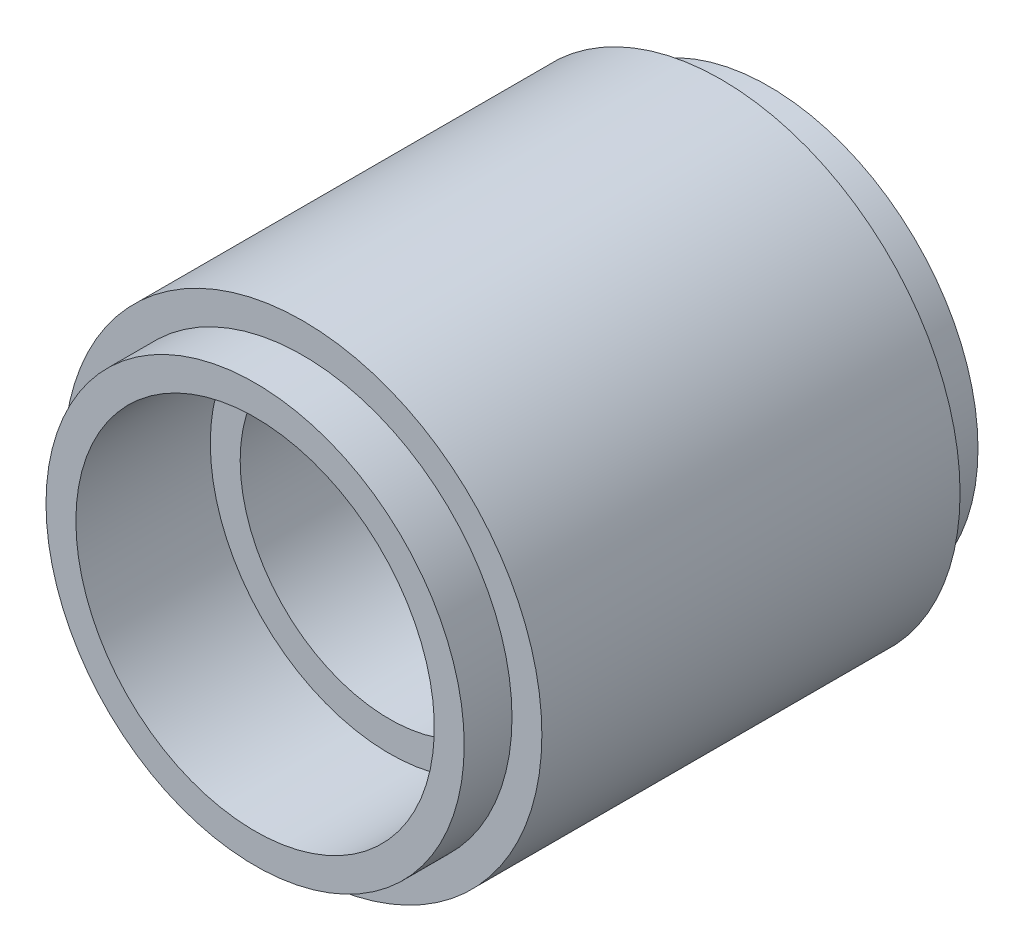
ISO-10303-21;
HEADER;
FILE_DESCRIPTION(('STEP AP214'),'2;1');
FILE_NAME('part.step','',(''),(''),'','','');
FILE_SCHEMA(('AUTOMOTIVE_DESIGN { 1 0 10303 214 1 1 1 1 }'));
ENDSEC;
DATA;
#1=APPLICATION_CONTEXT('core data for automotive mechanical design processes');
#2=APPLICATION_PROTOCOL_DEFINITION('international standard','automotive_design',2000,#1);
#3=PRODUCT_CONTEXT('',#1,'mechanical');
#4=PRODUCT('Part','Part','',(#3));
#5=PRODUCT_RELATED_PRODUCT_CATEGORY('part','',(#4));
#6=PRODUCT_DEFINITION_FORMATION('','',#4);
#7=PRODUCT_DEFINITION_CONTEXT('part definition',#1,'design');
#8=PRODUCT_DEFINITION('design','',#6,#7);
#9=PRODUCT_DEFINITION_SHAPE('','',#8);
#10=(LENGTH_UNIT() NAMED_UNIT(*) SI_UNIT(.MILLI.,.METRE.));
#11=(NAMED_UNIT(*) PLANE_ANGLE_UNIT() SI_UNIT($,.RADIAN.));
#12=(NAMED_UNIT(*) SI_UNIT($,.STERADIAN.) SOLID_ANGLE_UNIT());
#13=UNCERTAINTY_MEASURE_WITH_UNIT(LENGTH_MEASURE(1.E-05),#10,'distance_accuracy_value','');
#14=(GEOMETRIC_REPRESENTATION_CONTEXT(3) GLOBAL_UNCERTAINTY_ASSIGNED_CONTEXT((#13)) GLOBAL_UNIT_ASSIGNED_CONTEXT((#10,
#11,#12)) REPRESENTATION_CONTEXT('',''));
#15=CARTESIAN_POINT('',(0.,0.,0.));
#16=DIRECTION('',(0.,0.,1.));
#17=DIRECTION('',(1.,0.,0.));
#18=AXIS2_PLACEMENT_3D('',#15,#16,#17);
#19=CARTESIAN_POINT('',(0.,11.1125,11.1125));
#20=DIRECTION('',(0.,0.,1.));
#21=DIRECTION('',(1.,0.,0.));
#22=AXIS2_PLACEMENT_3D('',#19,#20,#21);
#23=PLANE('',#22);
#24=CARTESIAN_POINT('',(0.,0.,11.1125));
#25=DIRECTION('',(0.,0.,-1.));
#26=DIRECTION('',(-1.,0.,0.));
#27=AXIS2_PLACEMENT_3D('',#24,#25,#26);
#28=CIRCLE('',#27,11.1125);
#29=CARTESIAN_POINT('',(-11.1125,0.,11.1125));
#30=VERTEX_POINT('',#29);
#31=EDGE_CURVE('E79',#30,#30,#28,.T.);
#32=ORIENTED_EDGE('',*,*,#31,.T.);
#33=EDGE_LOOP('',(#32));
#34=FACE_BOUND('',#33,.T.);
#35=CARTESIAN_POINT('',(0.,0.,11.1125));
#36=DIRECTION('',(0.,0.,-1.));
#37=DIRECTION('',(-1.,0.,0.));
#38=AXIS2_PLACEMENT_3D('',#35,#36,#37);
#39=CIRCLE('',#38,12.7);
#40=CARTESIAN_POINT('',(-12.7,0.,11.1125));
#41=VERTEX_POINT('',#40);
#42=EDGE_CURVE('E10',#41,#41,#39,.T.);
#43=ORIENTED_EDGE('',*,*,#42,.F.);
#44=EDGE_LOOP('',(#43));
#45=FACE_BOUND('',#44,.T.);
#46=ADVANCED_FACE('F39',(#34,#45),#23,.T.);
#47=CARTESIAN_POINT('',(0.,0.,-12.1832674603758));
#48=DIRECTION('',(0.,0.,-1.));
#49=DIRECTION('',(-1.,0.,0.));
#50=AXIS2_PLACEMENT_3D('',#47,#48,#49);
#51=CYLINDRICAL_SURFACE('',#50,12.7);
#52=ORIENTED_EDGE('',*,*,#42,.T.);
#53=EDGE_LOOP('',(#52));
#54=FACE_BOUND('',#53,.T.);
#55=CARTESIAN_POINT('',(0.,0.,-11.1125));
#56=DIRECTION('',(0.,0.,-1.));
#57=DIRECTION('',(-1.,0.,0.));
#58=AXIS2_PLACEMENT_3D('',#55,#56,#57);
#59=CIRCLE('',#58,12.7);
#60=CARTESIAN_POINT('',(-12.7,0.,-11.1125));
#61=VERTEX_POINT('',#60);
#62=EDGE_CURVE('E45',#61,#61,#59,.T.);
#63=ORIENTED_EDGE('',*,*,#62,.F.);
#64=EDGE_LOOP('',(#63));
#65=FACE_BOUND('',#64,.T.);
#66=ADVANCED_FACE('F97',(#54,#65),#51,.T.);
#67=CARTESIAN_POINT('',(0.,12.7,-11.1125));
#68=DIRECTION('',(0.,0.,-1.));
#69=DIRECTION('',(-1.,0.,0.));
#70=AXIS2_PLACEMENT_3D('',#67,#68,#69);
#71=PLANE('',#70);
#72=ORIENTED_EDGE('',*,*,#62,.T.);
#73=EDGE_LOOP('',(#72));
#74=FACE_BOUND('',#73,.T.);
#75=CARTESIAN_POINT('',(0.,0.,-11.1125));
#76=DIRECTION('',(0.,0.,-1.));
#77=DIRECTION('',(-1.,0.,0.));
#78=AXIS2_PLACEMENT_3D('',#75,#76,#77);
#79=CIRCLE('',#78,11.1125);
#80=CARTESIAN_POINT('',(-11.1125,0.,-11.1125));
#81=VERTEX_POINT('',#80);
#82=EDGE_CURVE('E49',#81,#81,#79,.T.);
#83=ORIENTED_EDGE('',*,*,#82,.F.);
#84=EDGE_LOOP('',(#83));
#85=FACE_BOUND('',#84,.T.);
#86=ADVANCED_FACE('F101',(#74,#85),#71,.T.);
#87=CARTESIAN_POINT('',(0.,0.,-12.1832674603758));
#88=DIRECTION('',(0.,0.,-1.));
#89=DIRECTION('',(-1.,0.,0.));
#90=AXIS2_PLACEMENT_3D('',#87,#88,#89);
#91=CYLINDRICAL_SURFACE('',#90,11.1125);
#92=ORIENTED_EDGE('',*,*,#82,.T.);
#93=EDGE_LOOP('',(#92));
#94=FACE_BOUND('',#93,.T.);
#95=CARTESIAN_POINT('',(0.,0.,-13.6525));
#96=DIRECTION('',(0.,0.,-1.));
#97=DIRECTION('',(-1.,0.,0.));
#98=AXIS2_PLACEMENT_3D('',#95,#96,#97);
#99=CIRCLE('',#98,11.1125);
#100=CARTESIAN_POINT('',(-11.1125,0.,-13.6525));
#101=VERTEX_POINT('',#100);
#102=EDGE_CURVE('E53',#101,#101,#99,.T.);
#103=ORIENTED_EDGE('',*,*,#102,.F.);
#104=EDGE_LOOP('',(#103));
#105=FACE_BOUND('',#104,.T.);
#106=ADVANCED_FACE('F105',(#94,#105),#91,.T.);
#107=CARTESIAN_POINT('',(0.,11.1125,-13.6525));
#108=DIRECTION('',(0.,0.,-1.));
#109=DIRECTION('',(-1.,0.,0.));
#110=AXIS2_PLACEMENT_3D('',#107,#108,#109);
#111=PLANE('',#110);
#112=ORIENTED_EDGE('',*,*,#102,.T.);
#113=EDGE_LOOP('',(#112));
#114=FACE_BOUND('',#113,.T.);
#115=CARTESIAN_POINT('',(0.,0.,-13.6525));
#116=DIRECTION('',(0.,0.,-1.));
#117=DIRECTION('',(-1.,0.,0.));
#118=AXIS2_PLACEMENT_3D('',#115,#116,#117);
#119=CIRCLE('',#118,9.525);
#120=CARTESIAN_POINT('',(-9.525,0.,-13.6525));
#121=VERTEX_POINT('',#120);
#122=EDGE_CURVE('E58',#121,#121,#119,.T.);
#123=ORIENTED_EDGE('',*,*,#122,.F.);
#124=EDGE_LOOP('',(#123));
#125=FACE_BOUND('',#124,.T.);
#126=ADVANCED_FACE('F111',(#114,#125),#111,.T.);
#127=CARTESIAN_POINT('',(0.,0.,-12.1832674603758));
#128=DIRECTION('',(0.,0.,-1.));
#129=DIRECTION('',(-1.,0.,0.));
#130=AXIS2_PLACEMENT_3D('',#127,#128,#129);
#131=CYLINDRICAL_SURFACE('',#130,9.525);
#132=ORIENTED_EDGE('',*,*,#122,.T.);
#133=EDGE_LOOP('',(#132));
#134=FACE_BOUND('',#133,.T.);
#135=CARTESIAN_POINT('',(0.,0.,-6.50875));
#136=DIRECTION('',(0.,0.,-1.));
#137=DIRECTION('',(-1.,0.,0.));
#138=AXIS2_PLACEMENT_3D('',#135,#136,#137);
#139=CIRCLE('',#138,9.525);
#140=CARTESIAN_POINT('',(-9.525,0.,-6.50875));
#141=VERTEX_POINT('',#140);
#142=EDGE_CURVE('E61',#141,#141,#139,.T.);
#143=ORIENTED_EDGE('',*,*,#142,.F.);
#144=EDGE_LOOP('',(#143));
#145=FACE_BOUND('',#144,.T.);
#146=ADVANCED_FACE('F115',(#134,#145),#131,.F.);
#147=CARTESIAN_POINT('',(0.,9.525,-6.50875));
#148=DIRECTION('',(0.,0.,-1.));
#149=DIRECTION('',(-1.,0.,0.));
#150=AXIS2_PLACEMENT_3D('',#147,#148,#149);
#151=PLANE('',#150);
#152=ORIENTED_EDGE('',*,*,#142,.T.);
#153=EDGE_LOOP('',(#152));
#154=FACE_BOUND('',#153,.T.);
#155=CARTESIAN_POINT('',(0.,0.,-6.50875));
#156=DIRECTION('',(0.,0.,-1.));
#157=DIRECTION('',(-1.,0.,0.));
#158=AXIS2_PLACEMENT_3D('',#155,#156,#157);
#159=CIRCLE('',#158,7.9375);
#160=CARTESIAN_POINT('',(-7.9375,0.,-6.50875));
#161=VERTEX_POINT('',#160);
#162=EDGE_CURVE('E64',#161,#161,#159,.T.);
#163=ORIENTED_EDGE('',*,*,#162,.F.);
#164=EDGE_LOOP('',(#163));
#165=FACE_BOUND('',#164,.T.);
#166=ADVANCED_FACE('F119',(#154,#165),#151,.T.);
#167=CARTESIAN_POINT('',(0.,0.,-12.1832674603758));
#168=DIRECTION('',(0.,0.,-1.));
#169=DIRECTION('',(-1.,0.,0.));
#170=AXIS2_PLACEMENT_3D('',#167,#168,#169);
#171=CYLINDRICAL_SURFACE('',#170,7.9375);
#172=ORIENTED_EDGE('',*,*,#162,.T.);
#173=EDGE_LOOP('',(#172));
#174=FACE_BOUND('',#173,.T.);
#175=CARTESIAN_POINT('',(0.,0.,6.50875));
#176=DIRECTION('',(0.,0.,-1.));
#177=DIRECTION('',(-1.,0.,0.));
#178=AXIS2_PLACEMENT_3D('',#175,#176,#177);
#179=CIRCLE('',#178,7.9375);
#180=CARTESIAN_POINT('',(-7.9375,0.,6.50875));
#181=VERTEX_POINT('',#180);
#182=EDGE_CURVE('E67',#181,#181,#179,.T.);
#183=ORIENTED_EDGE('',*,*,#182,.F.);
#184=EDGE_LOOP('',(#183));
#185=FACE_BOUND('',#184,.T.);
#186=ADVANCED_FACE('F123',(#174,#185),#171,.F.);
#187=CARTESIAN_POINT('',(0.,7.9375,6.50875));
#188=DIRECTION('',(0.,0.,1.));
#189=DIRECTION('',(1.,0.,0.));
#190=AXIS2_PLACEMENT_3D('',#187,#188,#189);
#191=PLANE('',#190);
#192=ORIENTED_EDGE('',*,*,#182,.T.);
#193=EDGE_LOOP('',(#192));
#194=FACE_BOUND('',#193,.T.);
#195=CARTESIAN_POINT('',(0.,0.,6.50875));
#196=DIRECTION('',(0.,0.,-1.));
#197=DIRECTION('',(-1.,0.,0.));
#198=AXIS2_PLACEMENT_3D('',#195,#196,#197);
#199=CIRCLE('',#198,9.525);
#200=CARTESIAN_POINT('',(-9.525,0.,6.50875));
#201=VERTEX_POINT('',#200);
#202=EDGE_CURVE('E70',#201,#201,#199,.T.);
#203=ORIENTED_EDGE('',*,*,#202,.F.);
#204=EDGE_LOOP('',(#203));
#205=FACE_BOUND('',#204,.T.);
#206=ADVANCED_FACE('F127',(#194,#205),#191,.T.);
#207=CARTESIAN_POINT('',(0.,0.,-12.1832674603758));
#208=DIRECTION('',(0.,0.,-1.));
#209=DIRECTION('',(-1.,0.,0.));
#210=AXIS2_PLACEMENT_3D('',#207,#208,#209);
#211=CYLINDRICAL_SURFACE('',#210,9.525);
#212=ORIENTED_EDGE('',*,*,#202,.T.);
#213=EDGE_LOOP('',(#212));
#214=FACE_BOUND('',#213,.T.);
#215=CARTESIAN_POINT('',(0.,0.,13.6525));
#216=DIRECTION('',(0.,0.,-1.));
#217=DIRECTION('',(-1.,0.,0.));
#218=AXIS2_PLACEMENT_3D('',#215,#216,#217);
#219=CIRCLE('',#218,9.525);
#220=CARTESIAN_POINT('',(-9.525,0.,13.6525));
#221=VERTEX_POINT('',#220);
#222=EDGE_CURVE('E73',#221,#221,#219,.T.);
#223=ORIENTED_EDGE('',*,*,#222,.F.);
#224=EDGE_LOOP('',(#223));
#225=FACE_BOUND('',#224,.T.);
#226=ADVANCED_FACE('F93',(#214,#225),#211,.F.);
#227=CARTESIAN_POINT('',(0.,9.525,13.6525));
#228=DIRECTION('',(0.,0.,1.));
#229=DIRECTION('',(1.,0.,0.));
#230=AXIS2_PLACEMENT_3D('',#227,#228,#229);
#231=PLANE('',#230);
#232=ORIENTED_EDGE('',*,*,#222,.T.);
#233=EDGE_LOOP('',(#232));
#234=FACE_BOUND('',#233,.T.);
#235=CARTESIAN_POINT('',(0.,0.,13.6525));
#236=DIRECTION('',(0.,0.,-1.));
#237=DIRECTION('',(-1.,0.,0.));
#238=AXIS2_PLACEMENT_3D('',#235,#236,#237);
#239=CIRCLE('',#238,11.1125);
#240=CARTESIAN_POINT('',(-11.1125,0.,13.6525));
#241=VERTEX_POINT('',#240);
#242=EDGE_CURVE('E76',#241,#241,#239,.T.);
#243=ORIENTED_EDGE('',*,*,#242,.F.);
#244=EDGE_LOOP('',(#243));
#245=FACE_BOUND('',#244,.T.);
#246=ADVANCED_FACE('F87',(#234,#245),#231,.T.);
#247=CARTESIAN_POINT('',(0.,0.,-12.1832674603758));
#248=DIRECTION('',(0.,0.,-1.));
#249=DIRECTION('',(-1.,0.,0.));
#250=AXIS2_PLACEMENT_3D('',#247,#248,#249);
#251=CYLINDRICAL_SURFACE('',#250,11.1125);
#252=ORIENTED_EDGE('',*,*,#242,.T.);
#253=EDGE_LOOP('',(#252));
#254=FACE_BOUND('',#253,.T.);
#255=ORIENTED_EDGE('',*,*,#31,.F.);
#256=EDGE_LOOP('',(#255));
#257=FACE_BOUND('',#256,.T.);
#258=ADVANCED_FACE('F85',(#254,#257),#251,.T.);
#259=CLOSED_SHELL('',(#46,#66,#86,#106,#126,#146,#166,#186,#206,#226,#246,#258));
#260=MANIFOLD_SOLID_BREP('B2',#259);
#261=ADVANCED_BREP_SHAPE_REPRESENTATION('',(#18,#260),#14);
#262=SHAPE_DEFINITION_REPRESENTATION(#9,#261);
ENDSEC;
END-ISO-10303-21;
